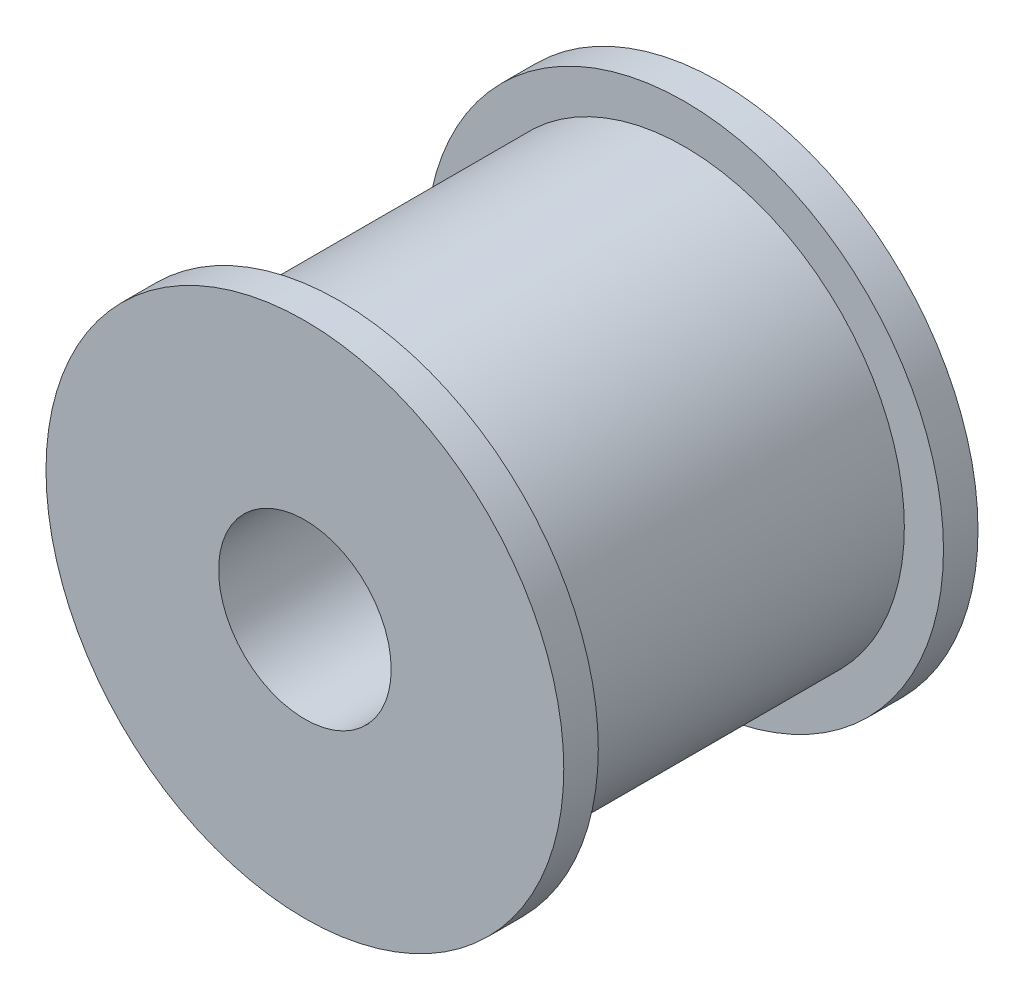
ISO-10303-21;
HEADER;
FILE_DESCRIPTION(('STEP AP214'),'2;1');
FILE_NAME('part.step','',(''),(''),'','','');
FILE_SCHEMA(('AUTOMOTIVE_DESIGN { 1 0 10303 214 1 1 1 1 }'));
ENDSEC;
DATA;
#1=APPLICATION_CONTEXT('core data for automotive mechanical design processes');
#2=APPLICATION_PROTOCOL_DEFINITION('international standard','automotive_design',2000,#1);
#3=PRODUCT_CONTEXT('',#1,'mechanical');
#4=PRODUCT('Part','Part','',(#3));
#5=PRODUCT_RELATED_PRODUCT_CATEGORY('part','',(#4));
#6=PRODUCT_DEFINITION_FORMATION('','',#4);
#7=PRODUCT_DEFINITION_CONTEXT('part definition',#1,'design');
#8=PRODUCT_DEFINITION('design','',#6,#7);
#9=PRODUCT_DEFINITION_SHAPE('','',#8);
#10=(LENGTH_UNIT() NAMED_UNIT(*) SI_UNIT(.MILLI.,.METRE.));
#11=(NAMED_UNIT(*) PLANE_ANGLE_UNIT() SI_UNIT($,.RADIAN.));
#12=(NAMED_UNIT(*) SI_UNIT($,.STERADIAN.) SOLID_ANGLE_UNIT());
#13=UNCERTAINTY_MEASURE_WITH_UNIT(LENGTH_MEASURE(1.E-05),#10,'distance_accuracy_value','');
#14=(GEOMETRIC_REPRESENTATION_CONTEXT(3) GLOBAL_UNCERTAINTY_ASSIGNED_CONTEXT((#13)) GLOBAL_UNIT_ASSIGNED_CONTEXT((#10,
#11,#12)) REPRESENTATION_CONTEXT('',''));
#15=CARTESIAN_POINT('',(0.,0.,0.));
#16=DIRECTION('',(0.,0.,1.));
#17=DIRECTION('',(1.,0.,0.));
#18=AXIS2_PLACEMENT_3D('',#15,#16,#17);
#19=CARTESIAN_POINT('',(0.,0.,6.));
#20=DIRECTION('',(0.,0.,-1.));
#21=DIRECTION('',(-1.,0.,0.));
#22=AXIS2_PLACEMENT_3D('',#19,#20,#21);
#23=CYLINDRICAL_SURFACE('',#22,7.5);
#24=CARTESIAN_POINT('',(0.,0.,-6.));
#25=DIRECTION('',(0.,0.,1.));
#26=DIRECTION('',(1.,0.,0.));
#27=AXIS2_PLACEMENT_3D('',#24,#25,#26);
#28=CIRCLE('',#27,7.5);
#29=CARTESIAN_POINT('',(7.5,0.,-6.));
#30=VERTEX_POINT('',#29);
#31=EDGE_CURVE('E35',#30,#30,#28,.T.);
#32=ORIENTED_EDGE('',*,*,#31,.T.);
#33=EDGE_LOOP('',(#32));
#34=FACE_BOUND('',#33,.T.);
#35=CARTESIAN_POINT('',(0.,0.,-5.));
#36=DIRECTION('',(0.,0.,1.));
#37=DIRECTION('',(1.,0.,0.));
#38=AXIS2_PLACEMENT_3D('',#35,#36,#37);
#39=CIRCLE('',#38,7.5);
#40=CARTESIAN_POINT('',(7.5,0.,-5.));
#41=VERTEX_POINT('',#40);
#42=EDGE_CURVE('E42',#41,#41,#39,.T.);
#43=ORIENTED_EDGE('',*,*,#42,.F.);
#44=EDGE_LOOP('',(#43));
#45=FACE_BOUND('',#44,.T.);
#46=ADVANCED_FACE('F31',(#34,#45),#23,.T.);
#47=CARTESIAN_POINT('',(0.,0.,-6.));
#48=DIRECTION('',(0.,0.,1.));
#49=DIRECTION('',(1.,0.,0.));
#50=AXIS2_PLACEMENT_3D('',#47,#48,#49);
#51=PLANE('',#50);
#52=CARTESIAN_POINT('',(0.,0.,-6.));
#53=DIRECTION('',(0.,0.,1.));
#54=DIRECTION('',(1.,0.,0.));
#55=AXIS2_PLACEMENT_3D('',#52,#53,#54);
#56=CIRCLE('',#55,2.5);
#57=CARTESIAN_POINT('',(2.5,0.,-6.));
#58=VERTEX_POINT('',#57);
#59=EDGE_CURVE('E53',#58,#58,#56,.T.);
#60=ORIENTED_EDGE('',*,*,#59,.T.);
#61=EDGE_LOOP('',(#60));
#62=FACE_BOUND('',#61,.T.);
#63=ORIENTED_EDGE('',*,*,#31,.F.);
#64=EDGE_LOOP('',(#63));
#65=FACE_BOUND('',#64,.T.);
#66=ADVANCED_FACE('F62',(#62,#65),#51,.F.);
#67=CARTESIAN_POINT('',(0.,0.,-5.));
#68=DIRECTION('',(0.,0.,1.));
#69=DIRECTION('',(1.,0.,0.));
#70=AXIS2_PLACEMENT_3D('',#67,#68,#69);
#71=PLANE('',#70);
#72=CARTESIAN_POINT('',(0.,0.,-5.));
#73=DIRECTION('',(0.,0.,1.));
#74=DIRECTION('',(1.,0.,0.));
#75=AXIS2_PLACEMENT_3D('',#72,#73,#74);
#76=CIRCLE('',#75,6.366385485);
#77=CARTESIAN_POINT('',(6.366385485,0.,-5.));
#78=VERTEX_POINT('',#77);
#79=EDGE_CURVE('E47',#78,#78,#76,.T.);
#80=ORIENTED_EDGE('',*,*,#79,.F.);
#81=EDGE_LOOP('',(#80));
#82=FACE_BOUND('',#81,.T.);
#83=ORIENTED_EDGE('',*,*,#42,.T.);
#84=EDGE_LOOP('',(#83));
#85=FACE_BOUND('',#84,.T.);
#86=ADVANCED_FACE('F89',(#82,#85),#71,.T.);
#87=CARTESIAN_POINT('',(0.,0.,5.));
#88=DIRECTION('',(0.,0.,1.));
#89=DIRECTION('',(1.,0.,0.));
#90=AXIS2_PLACEMENT_3D('',#87,#88,#89);
#91=PLANE('',#90);
#92=CARTESIAN_POINT('',(0.,0.,5.));
#93=DIRECTION('',(0.,0.,1.));
#94=DIRECTION('',(1.,0.,0.));
#95=AXIS2_PLACEMENT_3D('',#92,#93,#94);
#96=CIRCLE('',#95,6.366385485);
#97=CARTESIAN_POINT('',(6.366385485,0.,5.));
#98=VERTEX_POINT('',#97);
#99=EDGE_CURVE('E50',#98,#98,#96,.T.);
#100=ORIENTED_EDGE('',*,*,#99,.T.);
#101=EDGE_LOOP('',(#100));
#102=FACE_BOUND('',#101,.T.);
#103=CARTESIAN_POINT('',(0.,0.,5.));
#104=DIRECTION('',(0.,0.,1.));
#105=DIRECTION('',(1.,0.,0.));
#106=AXIS2_PLACEMENT_3D('',#103,#104,#105);
#107=CIRCLE('',#106,7.5);
#108=CARTESIAN_POINT('',(7.5,0.,5.));
#109=VERTEX_POINT('',#108);
#110=EDGE_CURVE('E44',#109,#109,#107,.T.);
#111=ORIENTED_EDGE('',*,*,#110,.F.);
#112=EDGE_LOOP('',(#111));
#113=FACE_BOUND('',#112,.T.);
#114=ADVANCED_FACE('F80',(#102,#113),#91,.F.);
#115=CARTESIAN_POINT('',(0.,0.,-5.));
#116=DIRECTION('',(0.,0.,1.));
#117=DIRECTION('',(1.,0.,0.));
#118=AXIS2_PLACEMENT_3D('',#115,#116,#117);
#119=CYLINDRICAL_SURFACE('',#118,6.366385485);
#120=ORIENTED_EDGE('',*,*,#79,.T.);
#121=EDGE_LOOP('',(#120));
#122=FACE_BOUND('',#121,.T.);
#123=ORIENTED_EDGE('',*,*,#99,.F.);
#124=EDGE_LOOP('',(#123));
#125=FACE_BOUND('',#124,.T.);
#126=ADVANCED_FACE('F73',(#122,#125),#119,.T.);
#127=CARTESIAN_POINT('',(0.,0.,6.));
#128=DIRECTION('',(0.,0.,1.));
#129=DIRECTION('',(1.,0.,0.));
#130=AXIS2_PLACEMENT_3D('',#127,#128,#129);
#131=PLANE('',#130);
#132=CARTESIAN_POINT('',(0.,0.,6.));
#133=DIRECTION('',(0.,0.,1.));
#134=DIRECTION('',(1.,0.,0.));
#135=AXIS2_PLACEMENT_3D('',#132,#133,#134);
#136=CIRCLE('',#135,2.5);
#137=CARTESIAN_POINT('',(2.5,0.,6.));
#138=VERTEX_POINT('',#137);
#139=EDGE_CURVE('E56',#138,#138,#136,.T.);
#140=ORIENTED_EDGE('',*,*,#139,.F.);
#141=EDGE_LOOP('',(#140));
#142=FACE_BOUND('',#141,.T.);
#143=CARTESIAN_POINT('',(0.,0.,6.));
#144=DIRECTION('',(0.,0.,1.));
#145=DIRECTION('',(1.,0.,0.));
#146=AXIS2_PLACEMENT_3D('',#143,#144,#145);
#147=CIRCLE('',#146,7.5);
#148=CARTESIAN_POINT('',(7.5,0.,6.));
#149=VERTEX_POINT('',#148);
#150=EDGE_CURVE('E10',#149,#149,#147,.T.);
#151=ORIENTED_EDGE('',*,*,#150,.T.);
#152=EDGE_LOOP('',(#151));
#153=FACE_BOUND('',#152,.T.);
#154=ADVANCED_FACE('F71',(#142,#153),#131,.T.);
#155=ORIENTED_EDGE('',*,*,#110,.T.);
#156=EDGE_LOOP('',(#155));
#157=FACE_BOUND('',#156,.T.);
#158=ORIENTED_EDGE('',*,*,#150,.F.);
#159=EDGE_LOOP('',(#158));
#160=FACE_BOUND('',#159,.T.);
#161=ADVANCED_FACE('F33',(#157,#160),#23,.T.);
#162=CARTESIAN_POINT('',(0.,0.,-6.));
#163=DIRECTION('',(0.,0.,1.));
#164=DIRECTION('',(1.,0.,0.));
#165=AXIS2_PLACEMENT_3D('',#162,#163,#164);
#166=CYLINDRICAL_SURFACE('',#165,2.5);
#167=ORIENTED_EDGE('',*,*,#59,.F.);
#168=EDGE_LOOP('',(#167));
#169=FACE_BOUND('',#168,.T.);
#170=ORIENTED_EDGE('',*,*,#139,.T.);
#171=EDGE_LOOP('',(#170));
#172=FACE_BOUND('',#171,.T.);
#173=ADVANCED_FACE('F65',(#169,#172),#166,.F.);
#174=CLOSED_SHELL('',(#46,#66,#86,#114,#126,#154,#161,#173));
#175=MANIFOLD_SOLID_BREP('B2',#174);
#176=ADVANCED_BREP_SHAPE_REPRESENTATION('',(#18,#175),#14);
#177=SHAPE_DEFINITION_REPRESENTATION(#9,#176);
ENDSEC;
END-ISO-10303-21;
